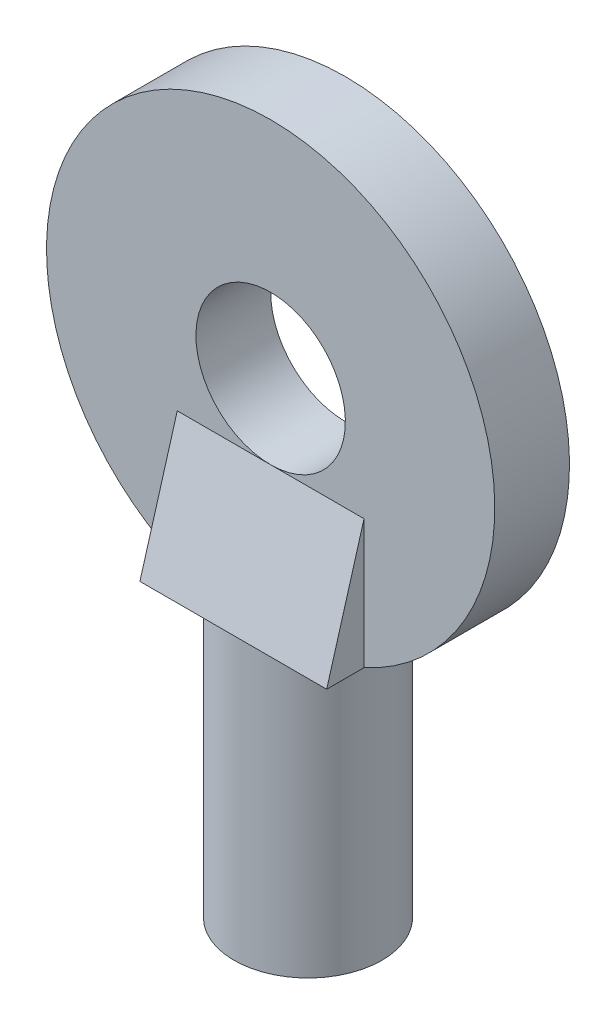
ISO-10303-21;
HEADER;
FILE_DESCRIPTION(('STEP AP214'),'2;1');
FILE_NAME('part.step','',(''),(''),'','','');
FILE_SCHEMA(('AUTOMOTIVE_DESIGN { 1 0 10303 214 1 1 1 1 }'));
ENDSEC;
DATA;
#1=APPLICATION_CONTEXT('core data for automotive mechanical design processes');
#2=APPLICATION_PROTOCOL_DEFINITION('international standard','automotive_design',2000,#1);
#3=PRODUCT_CONTEXT('',#1,'mechanical');
#4=PRODUCT('Part','Part','',(#3));
#5=PRODUCT_RELATED_PRODUCT_CATEGORY('part','',(#4));
#6=PRODUCT_DEFINITION_FORMATION('','',#4);
#7=PRODUCT_DEFINITION_CONTEXT('part definition',#1,'design');
#8=PRODUCT_DEFINITION('design','',#6,#7);
#9=PRODUCT_DEFINITION_SHAPE('','',#8);
#10=(LENGTH_UNIT() NAMED_UNIT(*) SI_UNIT(.MILLI.,.METRE.));
#11=(NAMED_UNIT(*) PLANE_ANGLE_UNIT() SI_UNIT($,.RADIAN.));
#12=(NAMED_UNIT(*) SI_UNIT($,.STERADIAN.) SOLID_ANGLE_UNIT());
#13=UNCERTAINTY_MEASURE_WITH_UNIT(LENGTH_MEASURE(1.E-05),#10,'distance_accuracy_value','');
#14=(GEOMETRIC_REPRESENTATION_CONTEXT(3) GLOBAL_UNCERTAINTY_ASSIGNED_CONTEXT((#13)) GLOBAL_UNIT_ASSIGNED_CONTEXT((#10,
#11,#12)) REPRESENTATION_CONTEXT('',''));
#15=CARTESIAN_POINT('',(0.,0.,0.));
#16=DIRECTION('',(0.,0.,1.));
#17=DIRECTION('',(1.,0.,0.));
#18=AXIS2_PLACEMENT_3D('',#15,#16,#17);
#19=CARTESIAN_POINT('',(2.5,-2.,1.));
#20=DIRECTION('',(-1.,0.,0.));
#21=DIRECTION('',(0.,0.,1.));
#22=AXIS2_PLACEMENT_3D('',#19,#20,#21);
#23=PLANE('',#22);
#24=DIRECTION('',(0.,-1.,0.));
#25=VECTOR('',#24,1.);
#26=CARTESIAN_POINT('',(2.5,0.,0.));
#27=LINE('',#26,#25);
#28=CARTESIAN_POINT('',(2.5,-2.,0.));
#29=VERTEX_POINT('',#28);
#30=CARTESIAN_POINT('',(2.5,-5.45435605731786,0.));
#31=VERTEX_POINT('',#30);
#32=EDGE_CURVE('E11',#29,#31,#27,.T.);
#33=ORIENTED_EDGE('',*,*,#32,.F.);
#34=DIRECTION('',(0.,0.960560192364437,-0.278072143237679));
#35=VECTOR('',#34,1.);
#36=CARTESIAN_POINT('',(2.5,-5.45435605731786,1.));
#37=LINE('',#36,#35);
#38=CARTESIAN_POINT('',(2.5,-5.45435605731786,1.));
#39=VERTEX_POINT('',#38);
#40=EDGE_CURVE('E103',#39,#29,#37,.T.);
#41=ORIENTED_EDGE('',*,*,#40,.F.);
#42=DIRECTION('',(0.,0.,1.));
#43=VECTOR('',#42,1.);
#44=CARTESIAN_POINT('',(2.5,-5.45435605731786,1.));
#45=LINE('',#44,#43);
#46=EDGE_CURVE('E114',#31,#39,#45,.T.);
#47=ORIENTED_EDGE('',*,*,#46,.F.);
#48=EDGE_LOOP('',(#33,#41,#47));
#49=FACE_BOUND('',#48,.T.);
#50=ADVANCED_FACE('F41',(#49),#23,.F.);
#51=CARTESIAN_POINT('',(-2.5,-5.45435605731786,1.));
#52=DIRECTION('',(1.,0.,0.));
#53=DIRECTION('',(0.,0.,-1.));
#54=AXIS2_PLACEMENT_3D('',#51,#52,#53);
#55=PLANE('',#54);
#56=DIRECTION('',(0.,1.,0.));
#57=VECTOR('',#56,1.);
#58=CARTESIAN_POINT('',(-2.5,0.,-2.));
#59=LINE('',#58,#57);
#60=CARTESIAN_POINT('',(-2.5,-5.45435605731786,-2.));
#61=VERTEX_POINT('',#60);
#62=CARTESIAN_POINT('',(-2.5,-2.,-2.));
#63=VERTEX_POINT('',#62);
#64=EDGE_CURVE('E135',#61,#63,#59,.T.);
#65=ORIENTED_EDGE('',*,*,#64,.T.);
#66=DIRECTION('',(0.,-0.960560192364437,-0.278072143237679));
#67=VECTOR('',#66,1.);
#68=CARTESIAN_POINT('',(-2.5,-4.38593593171955,-2.69070353262081));
#69=LINE('',#68,#67);
#70=CARTESIAN_POINT('',(-2.5,-5.45435605731786,-3.));
#71=VERTEX_POINT('',#70);
#72=EDGE_CURVE('E117',#63,#71,#69,.T.);
#73=ORIENTED_EDGE('',*,*,#72,.T.);
#74=DIRECTION('',(0.,0.,-1.));
#75=VECTOR('',#74,1.);
#76=CARTESIAN_POINT('',(-2.5,-5.45435605731786,-3.));
#77=LINE('',#76,#75);
#78=EDGE_CURVE('E109',#61,#71,#77,.T.);
#79=ORIENTED_EDGE('',*,*,#78,.F.);
#80=EDGE_LOOP('',(#65,#73,#79));
#81=FACE_BOUND('',#80,.T.);
#82=ADVANCED_FACE('F192',(#81),#55,.F.);
#83=CARTESIAN_POINT('',(0.,0.,-2.));
#84=DIRECTION('',(0.,0.,1.));
#85=DIRECTION('',(1.,0.,0.));
#86=AXIS2_PLACEMENT_3D('',#83,#84,#85);
#87=CYLINDRICAL_SURFACE('',#86,6.);
#88=CARTESIAN_POINT('',(0.,0.,0.));
#89=DIRECTION('',(0.,0.,1.));
#90=DIRECTION('',(1.,0.,0.));
#91=AXIS2_PLACEMENT_3D('',#88,#89,#90);
#92=CIRCLE('',#91,6.);
#93=CARTESIAN_POINT('',(-2.5,-5.45435605731786,0.));
#94=VERTEX_POINT('',#93);
#95=EDGE_CURVE('E155',#31,#94,#92,.T.);
#96=ORIENTED_EDGE('',*,*,#95,.F.);
#97=DIRECTION('',(0.,0.,1.));
#98=VECTOR('',#97,1.);
#99=CARTESIAN_POINT('',(2.5,-5.45435605731786,-2.));
#100=LINE('',#99,#98);
#101=CARTESIAN_POINT('',(2.5,-5.45435605731786,-2.));
#102=VERTEX_POINT('',#101);
#103=EDGE_CURVE('E122',#31,#102,#100,.F.);
#104=ORIENTED_EDGE('',*,*,#103,.T.);
#105=CARTESIAN_POINT('',(0.,0.,-2.));
#106=DIRECTION('',(0.,0.,1.));
#107=DIRECTION('',(1.,0.,0.));
#108=AXIS2_PLACEMENT_3D('',#105,#106,#107);
#109=CIRCLE('',#108,6.);
#110=EDGE_CURVE('E154',#102,#61,#109,.T.);
#111=ORIENTED_EDGE('',*,*,#110,.T.);
#112=DIRECTION('',(0.,0.,1.));
#113=VECTOR('',#112,1.);
#114=CARTESIAN_POINT('',(-2.5,-5.45435605731786,-2.));
#115=LINE('',#114,#113);
#116=EDGE_CURVE('E57',#61,#94,#115,.T.);
#117=ORIENTED_EDGE('',*,*,#116,.T.);
#118=EDGE_LOOP('',(#96,#104,#111,#117));
#119=FACE_BOUND('',#118,.T.);
#120=ADVANCED_FACE('F182',(#119),#87,.T.);
#121=CARTESIAN_POINT('',(0.,0.,-2.));
#122=DIRECTION('',(0.,0.,1.));
#123=DIRECTION('',(1.,0.,0.));
#124=AXIS2_PLACEMENT_3D('',#121,#122,#123);
#125=PLANE('',#124);
#126=DIRECTION('',(0.,-1.,0.));
#127=VECTOR('',#126,1.);
#128=CARTESIAN_POINT('',(2.5,0.,-2.));
#129=LINE('',#128,#127);
#130=CARTESIAN_POINT('',(2.5,-2.,-2.));
#131=VERTEX_POINT('',#130);
#132=EDGE_CURVE('E145',#131,#102,#129,.T.);
#133=ORIENTED_EDGE('',*,*,#132,.F.);
#134=DIRECTION('',(1.,0.,0.));
#135=VECTOR('',#134,1.);
#136=CARTESIAN_POINT('',(0.,-2.,-2.));
#137=LINE('',#136,#135);
#138=CARTESIAN_POINT('',(0.,-2.,-2.));
#139=VERTEX_POINT('',#138);
#140=EDGE_CURVE('E139',#139,#131,#137,.T.);
#141=ORIENTED_EDGE('',*,*,#140,.F.);
#142=CARTESIAN_POINT('',(0.,0.,-2.));
#143=DIRECTION('',(0.,0.,1.));
#144=DIRECTION('',(1.,0.,0.));
#145=AXIS2_PLACEMENT_3D('',#142,#143,#144);
#146=CIRCLE('',#145,2.);
#147=EDGE_CURVE('E150',#139,#139,#146,.T.);
#148=ORIENTED_EDGE('',*,*,#147,.T.);
#149=EDGE_CURVE('E142',#63,#139,#137,.T.);
#150=ORIENTED_EDGE('',*,*,#149,.F.);
#151=ORIENTED_EDGE('',*,*,#64,.F.);
#152=ORIENTED_EDGE('',*,*,#110,.F.);
#153=EDGE_LOOP('',(#133,#141,#148,#150,#151,#152));
#154=FACE_BOUND('',#153,.T.);
#155=ADVANCED_FACE('F187',(#154),#125,.F.);
#156=CARTESIAN_POINT('',(0.,0.,0.));
#157=DIRECTION('',(0.,0.,1.));
#158=DIRECTION('',(1.,0.,0.));
#159=AXIS2_PLACEMENT_3D('',#156,#157,#158);
#160=PLANE('',#159);
#161=DIRECTION('',(0.,1.,0.));
#162=VECTOR('',#161,1.);
#163=CARTESIAN_POINT('',(-2.5,0.,0.));
#164=LINE('',#163,#162);
#165=CARTESIAN_POINT('',(-2.5,-2.,0.));
#166=VERTEX_POINT('',#165);
#167=EDGE_CURVE('E159',#94,#166,#164,.T.);
#168=ORIENTED_EDGE('',*,*,#167,.T.);
#169=DIRECTION('',(1.,0.,0.));
#170=VECTOR('',#169,1.);
#171=CARTESIAN_POINT('',(0.,-2.,0.));
#172=LINE('',#171,#170);
#173=CARTESIAN_POINT('',(0.,-2.,0.));
#174=VERTEX_POINT('',#173);
#175=EDGE_CURVE('E168',#166,#174,#172,.T.);
#176=ORIENTED_EDGE('',*,*,#175,.T.);
#177=CARTESIAN_POINT('',(0.,0.,0.));
#178=DIRECTION('',(0.,0.,1.));
#179=DIRECTION('',(1.,0.,0.));
#180=AXIS2_PLACEMENT_3D('',#177,#178,#179);
#181=CIRCLE('',#180,2.);
#182=EDGE_CURVE('E149',#174,#174,#181,.T.);
#183=ORIENTED_EDGE('',*,*,#182,.F.);
#184=EDGE_CURVE('E50',#174,#29,#172,.T.);
#185=ORIENTED_EDGE('',*,*,#184,.T.);
#186=ORIENTED_EDGE('',*,*,#32,.T.);
#187=ORIENTED_EDGE('',*,*,#95,.T.);
#188=EDGE_LOOP('',(#168,#176,#183,#185,#186,#187));
#189=FACE_BOUND('',#188,.T.);
#190=ADVANCED_FACE('F174',(#189),#160,.T.);
#191=CARTESIAN_POINT('',(0.,0.,-2.));
#192=DIRECTION('',(0.,0.,1.));
#193=DIRECTION('',(1.,0.,0.));
#194=AXIS2_PLACEMENT_3D('',#191,#192,#193);
#195=CYLINDRICAL_SURFACE('',#194,2.);
#196=ORIENTED_EDGE('',*,*,#147,.F.);
#197=EDGE_LOOP('',(#196));
#198=FACE_BOUND('',#197,.T.);
#199=ORIENTED_EDGE('',*,*,#182,.T.);
#200=EDGE_LOOP('',(#199));
#201=FACE_BOUND('',#200,.T.);
#202=ADVANCED_FACE('F43',(#198,#201),#195,.F.);
#203=CARTESIAN_POINT('',(2.5,-5.45435605731786,-3.));
#204=VERTEX_POINT('',#203);
#205=EDGE_CURVE('E124',#204,#102,#45,.T.);
#206=ORIENTED_EDGE('',*,*,#205,.F.);
#207=DIRECTION('',(0.,-0.960560192364437,-0.278072143237679));
#208=VECTOR('',#207,1.);
#209=CARTESIAN_POINT('',(2.5,-5.45435605731786,-3.));
#210=LINE('',#209,#208);
#211=EDGE_CURVE('E118',#131,#204,#210,.T.);
#212=ORIENTED_EDGE('',*,*,#211,.F.);
#213=ORIENTED_EDGE('',*,*,#132,.T.);
#214=EDGE_LOOP('',(#206,#212,#213));
#215=FACE_BOUND('',#214,.T.);
#216=ADVANCED_FACE('F242',(#215),#23,.F.);
#217=CARTESIAN_POINT('',(-2.5,-5.45435605731786,1.));
#218=VERTEX_POINT('',#217);
#219=EDGE_CURVE('E62',#218,#94,#77,.T.);
#220=ORIENTED_EDGE('',*,*,#219,.F.);
#221=DIRECTION('',(0.,0.960560192364437,-0.278072143237679));
#222=VECTOR('',#221,1.);
#223=CARTESIAN_POINT('',(-2.5,-5.45435605731786,1.));
#224=LINE('',#223,#222);
#225=EDGE_CURVE('E106',#218,#166,#224,.T.);
#226=ORIENTED_EDGE('',*,*,#225,.T.);
#227=ORIENTED_EDGE('',*,*,#167,.F.);
#228=EDGE_LOOP('',(#220,#226,#227));
#229=FACE_BOUND('',#228,.T.);
#230=ADVANCED_FACE('F177',(#229),#55,.F.);
#231=CARTESIAN_POINT('',(0.,-5.45435605731786,0.));
#232=DIRECTION('',(0.,1.,0.));
#233=DIRECTION('',(-1.,0.,0.));
#234=AXIS2_PLACEMENT_3D('',#231,#232,#233);
#235=PLANE('',#234);
#236=CARTESIAN_POINT('',(0.,-5.45435605731786,-1.));
#237=DIRECTION('',(0.,-1.,0.));
#238=DIRECTION('',(1.,0.,0.));
#239=AXIS2_PLACEMENT_3D('',#236,#237,#238);
#240=CIRCLE('',#239,1.98010618733613);
#241=CARTESIAN_POINT('',(1.98010618733613,-5.45435605731786,-1.));
#242=VERTEX_POINT('',#241);
#243=EDGE_CURVE('E110',#242,#242,#240,.T.);
#244=ORIENTED_EDGE('',*,*,#243,.F.);
#245=EDGE_LOOP('',(#244));
#246=FACE_BOUND('',#245,.T.);
#247=DIRECTION('',(-1.,0.,0.));
#248=VECTOR('',#247,1.);
#249=CARTESIAN_POINT('',(-2.5,-5.45435605731786,1.));
#250=LINE('',#249,#248);
#251=EDGE_CURVE('E100',#39,#218,#250,.T.);
#252=ORIENTED_EDGE('',*,*,#251,.T.);
#253=ORIENTED_EDGE('',*,*,#219,.T.);
#254=ORIENTED_EDGE('',*,*,#116,.F.);
#255=ORIENTED_EDGE('',*,*,#78,.T.);
#256=DIRECTION('',(1.,0.,0.));
#257=VECTOR('',#256,1.);
#258=CARTESIAN_POINT('',(2.5,-5.45435605731786,-3.));
#259=LINE('',#258,#257);
#260=EDGE_CURVE('E125',#71,#204,#259,.T.);
#261=ORIENTED_EDGE('',*,*,#260,.T.);
#262=ORIENTED_EDGE('',*,*,#205,.T.);
#263=ORIENTED_EDGE('',*,*,#103,.F.);
#264=ORIENTED_EDGE('',*,*,#46,.T.);
#265=EDGE_LOOP('',(#252,#253,#254,#255,#261,#262,#263,#264));
#266=FACE_BOUND('',#265,.T.);
#267=ADVANCED_FACE('F120',(#246,#266),#235,.F.);
#268=CARTESIAN_POINT('',(0.,-5.45435605731786,-1.));
#269=DIRECTION('',(0.,-1.,0.));
#270=DIRECTION('',(1.,0.,0.));
#271=AXIS2_PLACEMENT_3D('',#268,#269,#270);
#272=CYLINDRICAL_SURFACE('',#271,1.98010618733613);
#273=ORIENTED_EDGE('',*,*,#243,.T.);
#274=EDGE_LOOP('',(#273));
#275=FACE_BOUND('',#274,.T.);
#276=CARTESIAN_POINT('',(0.,-13.,-1.));
#277=DIRECTION('',(0.,-1.,0.));
#278=DIRECTION('',(1.,0.,0.));
#279=AXIS2_PLACEMENT_3D('',#276,#277,#278);
#280=CIRCLE('',#279,1.98010618733613);
#281=CARTESIAN_POINT('',(1.98010618733613,-13.,-1.));
#282=VERTEX_POINT('',#281);
#283=EDGE_CURVE('E179',#282,#282,#280,.T.);
#284=ORIENTED_EDGE('',*,*,#283,.F.);
#285=EDGE_LOOP('',(#284));
#286=FACE_BOUND('',#285,.T.);
#287=ADVANCED_FACE('F227',(#275,#286),#272,.T.);
#288=CARTESIAN_POINT('',(-2.5,-13.,1.));
#289=DIRECTION('',(0.,1.,0.));
#290=DIRECTION('',(-1.,0.,0.));
#291=AXIS2_PLACEMENT_3D('',#288,#289,#290);
#292=PLANE('',#291);
#293=CARTESIAN_POINT('',(0.,-13.,-1.));
#294=DIRECTION('',(0.,-1.,0.));
#295=DIRECTION('',(1.,0.,0.));
#296=AXIS2_PLACEMENT_3D('',#293,#294,#295);
#297=CIRCLE('',#296,0.4);
#298=CARTESIAN_POINT('',(0.400000000000002,-13.,-1.));
#299=VERTEX_POINT('',#298);
#300=EDGE_CURVE('E207',#299,#299,#297,.T.);
#301=ORIENTED_EDGE('',*,*,#300,.F.);
#302=EDGE_LOOP('',(#301));
#303=FACE_BOUND('',#302,.T.);
#304=ORIENTED_EDGE('',*,*,#283,.T.);
#305=EDGE_LOOP('',(#304));
#306=FACE_BOUND('',#305,.T.);
#307=ADVANCED_FACE('F223',(#303,#306),#292,.F.);
#308=CARTESIAN_POINT('',(-5.5,-5.45435605731786,-3.));
#309=DIRECTION('',(0.,-0.278072143237679,0.960560192364437));
#310=DIRECTION('',(0.,-0.960560192364437,-0.278072143237679));
#311=AXIS2_PLACEMENT_3D('',#308,#309,#310);
#312=PLANE('',#311);
#313=ORIENTED_EDGE('',*,*,#149,.T.);
#314=ORIENTED_EDGE('',*,*,#140,.T.);
#315=ORIENTED_EDGE('',*,*,#211,.T.);
#316=ORIENTED_EDGE('',*,*,#260,.F.);
#317=ORIENTED_EDGE('',*,*,#72,.F.);
#318=EDGE_LOOP('',(#313,#314,#315,#316,#317));
#319=FACE_BOUND('',#318,.T.);
#320=ADVANCED_FACE('F226',(#319),#312,.F.);
#321=CARTESIAN_POINT('',(-5.5,-5.45435605731786,1.));
#322=DIRECTION('',(0.,-0.278072143237679,-0.960560192364437));
#323=DIRECTION('',(0.,0.960560192364437,-0.278072143237679));
#324=AXIS2_PLACEMENT_3D('',#321,#322,#323);
#325=PLANE('',#324);
#326=ORIENTED_EDGE('',*,*,#251,.F.);
#327=ORIENTED_EDGE('',*,*,#40,.T.);
#328=ORIENTED_EDGE('',*,*,#184,.F.);
#329=ORIENTED_EDGE('',*,*,#175,.F.);
#330=ORIENTED_EDGE('',*,*,#225,.F.);
#331=EDGE_LOOP('',(#326,#327,#328,#329,#330));
#332=FACE_BOUND('',#331,.T.);
#333=ADVANCED_FACE('F102',(#332),#325,.F.);
#334=CARTESIAN_POINT('',(0.,-9.,-1.));
#335=DIRECTION('',(0.,-1.,0.));
#336=DIRECTION('',(1.,0.,0.));
#337=AXIS2_PLACEMENT_3D('',#334,#335,#336);
#338=CYLINDRICAL_SURFACE('',#337,0.4);
#339=CARTESIAN_POINT('',(0.,-9.,-1.));
#340=DIRECTION('',(0.,-1.,0.));
#341=DIRECTION('',(1.,0.,0.));
#342=AXIS2_PLACEMENT_3D('',#339,#340,#341);
#343=CIRCLE('',#342,0.4);
#344=CARTESIAN_POINT('',(0.400000000000001,-9.,-1.));
#345=VERTEX_POINT('',#344);
#346=EDGE_CURVE('E205',#345,#345,#343,.T.);
#347=ORIENTED_EDGE('',*,*,#346,.F.);
#348=EDGE_LOOP('',(#347));
#349=FACE_BOUND('',#348,.T.);
#350=ORIENTED_EDGE('',*,*,#300,.T.);
#351=EDGE_LOOP('',(#350));
#352=FACE_BOUND('',#351,.T.);
#353=ADVANCED_FACE('F217',(#349,#352),#338,.F.);
#354=CARTESIAN_POINT('',(0.,-9.,-1.));
#355=DIRECTION('',(0.,-1.,0.));
#356=DIRECTION('',(1.,0.,0.));
#357=AXIS2_PLACEMENT_3D('',#354,#355,#356);
#358=PLANE('',#357);
#359=ORIENTED_EDGE('',*,*,#346,.T.);
#360=EDGE_LOOP('',(#359));
#361=FACE_BOUND('',#360,.T.);
#362=ADVANCED_FACE('F215',(#361),#358,.T.);
#363=CLOSED_SHELL('',(#50,#82,#120,#155,#190,#202,#216,#230,#267,#287,#307,#320,#333,#353,#362));
#364=MANIFOLD_SOLID_BREP('B2',#363);
#365=ADVANCED_BREP_SHAPE_REPRESENTATION('',(#18,#364),#14);
#366=SHAPE_DEFINITION_REPRESENTATION(#9,#365);
ENDSEC;
END-ISO-10303-21;
